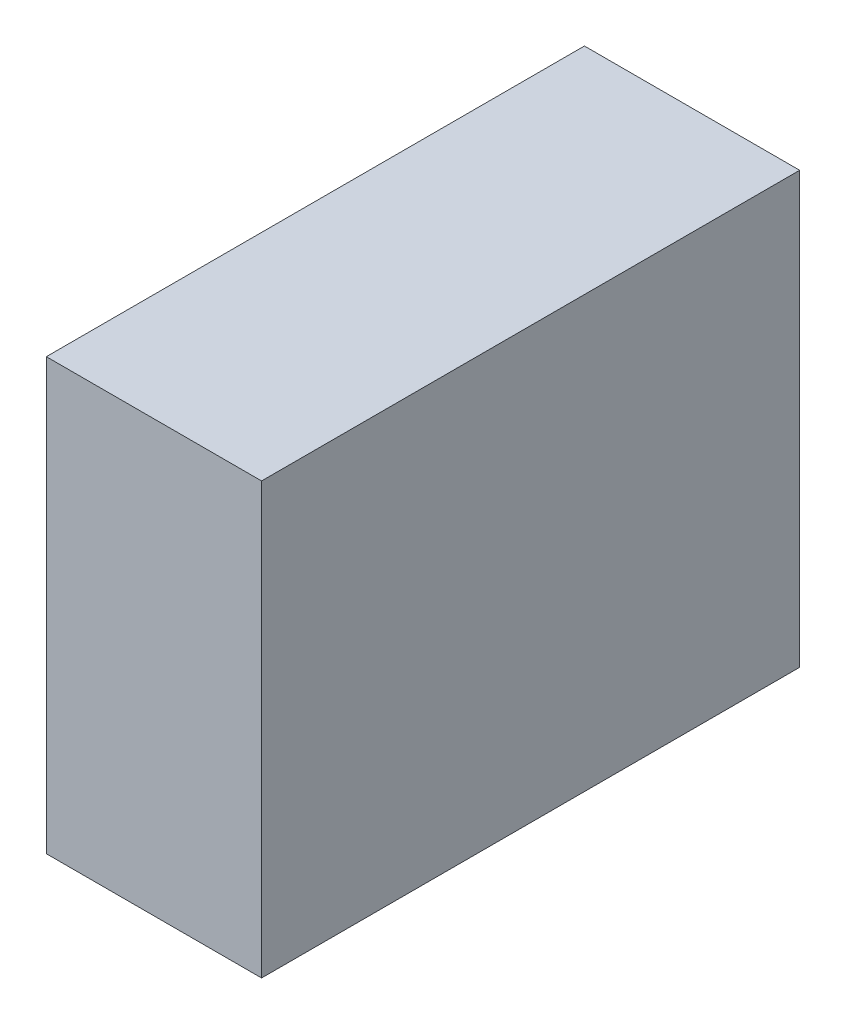
ISO-10303-21;
HEADER;
FILE_DESCRIPTION(('STEP AP214'),'2;1');
FILE_NAME('part.step','',(''),(''),'','','');
FILE_SCHEMA(('AUTOMOTIVE_DESIGN { 1 0 10303 214 1 1 1 1 }'));
ENDSEC;
DATA;
#1=APPLICATION_CONTEXT('core data for automotive mechanical design processes');
#2=APPLICATION_PROTOCOL_DEFINITION('international standard','automotive_design',2000,#1);
#3=PRODUCT_CONTEXT('',#1,'mechanical');
#4=PRODUCT('Part','Part','',(#3));
#5=PRODUCT_RELATED_PRODUCT_CATEGORY('part','',(#4));
#6=PRODUCT_DEFINITION_FORMATION('','',#4);
#7=PRODUCT_DEFINITION_CONTEXT('part definition',#1,'design');
#8=PRODUCT_DEFINITION('design','',#6,#7);
#9=PRODUCT_DEFINITION_SHAPE('','',#8);
#10=(LENGTH_UNIT() NAMED_UNIT(*) SI_UNIT(.MILLI.,.METRE.));
#11=(NAMED_UNIT(*) PLANE_ANGLE_UNIT() SI_UNIT($,.RADIAN.));
#12=(NAMED_UNIT(*) SI_UNIT($,.STERADIAN.) SOLID_ANGLE_UNIT());
#13=UNCERTAINTY_MEASURE_WITH_UNIT(LENGTH_MEASURE(1.E-05),#10,'distance_accuracy_value','');
#14=(GEOMETRIC_REPRESENTATION_CONTEXT(3) GLOBAL_UNCERTAINTY_ASSIGNED_CONTEXT((#13)) GLOBAL_UNIT_ASSIGNED_CONTEXT((#10,
#11,#12)) REPRESENTATION_CONTEXT('',''));
#15=CARTESIAN_POINT('',(0.,0.,0.));
#16=DIRECTION('',(0.,0.,1.));
#17=DIRECTION('',(1.,0.,0.));
#18=AXIS2_PLACEMENT_3D('',#15,#16,#17);
#19=CARTESIAN_POINT('',(-101.6,-203.2,254.));
#20=DIRECTION('',(1.,0.,0.));
#21=DIRECTION('',(0.,0.,-1.));
#22=AXIS2_PLACEMENT_3D('',#19,#20,#21);
#23=PLANE('',#22);
#24=DIRECTION('',(0.,-1.,0.));
#25=VECTOR('',#24,1.);
#26=CARTESIAN_POINT('',(-101.6,-203.2,-254.));
#27=LINE('',#26,#25);
#28=CARTESIAN_POINT('',(-101.6,203.2,-254.));
#29=VERTEX_POINT('',#28);
#30=CARTESIAN_POINT('',(-101.6,-203.2,-254.));
#31=VERTEX_POINT('',#30);
#32=EDGE_CURVE('E113',#29,#31,#27,.T.);
#33=ORIENTED_EDGE('',*,*,#32,.T.);
#34=DIRECTION('',(0.,0.,-1.));
#35=VECTOR('',#34,1.);
#36=CARTESIAN_POINT('',(-101.6,-203.2,254.));
#37=LINE('',#36,#35);
#38=CARTESIAN_POINT('',(-101.6,-203.2,254.));
#39=VERTEX_POINT('',#38);
#40=EDGE_CURVE('E11',#39,#31,#37,.T.);
#41=ORIENTED_EDGE('',*,*,#40,.F.);
#42=DIRECTION('',(0.,-1.,0.));
#43=VECTOR('',#42,1.);
#44=CARTESIAN_POINT('',(-101.6,-203.2,254.));
#45=LINE('',#44,#43);
#46=CARTESIAN_POINT('',(-101.6,203.2,254.));
#47=VERTEX_POINT('',#46);
#48=EDGE_CURVE('E97',#47,#39,#45,.T.);
#49=ORIENTED_EDGE('',*,*,#48,.F.);
#50=DIRECTION('',(0.,0.,-1.));
#51=VECTOR('',#50,1.);
#52=CARTESIAN_POINT('',(-101.6,203.2,254.));
#53=LINE('',#52,#51);
#54=EDGE_CURVE('E109',#47,#29,#53,.T.);
#55=ORIENTED_EDGE('',*,*,#54,.T.);
#56=EDGE_LOOP('',(#33,#41,#49,#55));
#57=FACE_BOUND('',#56,.T.);
#58=ADVANCED_FACE('F45',(#57),#23,.F.);
#59=CARTESIAN_POINT('',(101.6,-203.2,254.));
#60=DIRECTION('',(0.,1.,0.));
#61=DIRECTION('',(-1.,0.,0.));
#62=AXIS2_PLACEMENT_3D('',#59,#60,#61);
#63=PLANE('',#62);
#64=DIRECTION('',(1.,0.,0.));
#65=VECTOR('',#64,1.);
#66=CARTESIAN_POINT('',(101.6,-203.2,-254.));
#67=LINE('',#66,#65);
#68=CARTESIAN_POINT('',(101.6,-203.2,-254.));
#69=VERTEX_POINT('',#68);
#70=EDGE_CURVE('E102',#31,#69,#67,.T.);
#71=ORIENTED_EDGE('',*,*,#70,.T.);
#72=DIRECTION('',(0.,0.,-1.));
#73=VECTOR('',#72,1.);
#74=CARTESIAN_POINT('',(101.6,-203.2,254.));
#75=LINE('',#74,#73);
#76=CARTESIAN_POINT('',(101.6,-203.2,254.));
#77=VERTEX_POINT('',#76);
#78=EDGE_CURVE('E54',#77,#69,#75,.T.);
#79=ORIENTED_EDGE('',*,*,#78,.F.);
#80=DIRECTION('',(1.,0.,0.));
#81=VECTOR('',#80,1.);
#82=CARTESIAN_POINT('',(101.6,-203.2,254.));
#83=LINE('',#82,#81);
#84=EDGE_CURVE('E92',#39,#77,#83,.T.);
#85=ORIENTED_EDGE('',*,*,#84,.F.);
#86=ORIENTED_EDGE('',*,*,#40,.T.);
#87=EDGE_LOOP('',(#71,#79,#85,#86));
#88=FACE_BOUND('',#87,.T.);
#89=ADVANCED_FACE('F101',(#88),#63,.F.);
#90=CARTESIAN_POINT('',(101.6,-203.2,254.));
#91=DIRECTION('',(-1.,0.,0.));
#92=DIRECTION('',(0.,0.,1.));
#93=AXIS2_PLACEMENT_3D('',#90,#91,#92);
#94=PLANE('',#93);
#95=DIRECTION('',(0.,1.,0.));
#96=VECTOR('',#95,1.);
#97=CARTESIAN_POINT('',(101.6,-203.2,-254.));
#98=LINE('',#97,#96);
#99=CARTESIAN_POINT('',(101.6,203.2,-254.));
#100=VERTEX_POINT('',#99);
#101=EDGE_CURVE('E79',#69,#100,#98,.T.);
#102=ORIENTED_EDGE('',*,*,#101,.T.);
#103=DIRECTION('',(0.,0.,-1.));
#104=VECTOR('',#103,1.);
#105=CARTESIAN_POINT('',(101.6,203.2,254.));
#106=LINE('',#105,#104);
#107=CARTESIAN_POINT('',(101.6,203.2,254.));
#108=VERTEX_POINT('',#107);
#109=EDGE_CURVE('E104',#108,#100,#106,.T.);
#110=ORIENTED_EDGE('',*,*,#109,.F.);
#111=DIRECTION('',(0.,1.,0.));
#112=VECTOR('',#111,1.);
#113=CARTESIAN_POINT('',(101.6,-203.2,254.));
#114=LINE('',#113,#112);
#115=EDGE_CURVE('E95',#77,#108,#114,.T.);
#116=ORIENTED_EDGE('',*,*,#115,.F.);
#117=ORIENTED_EDGE('',*,*,#78,.T.);
#118=EDGE_LOOP('',(#102,#110,#116,#117));
#119=FACE_BOUND('',#118,.T.);
#120=ADVANCED_FACE('F105',(#119),#94,.F.);
#121=CARTESIAN_POINT('',(101.6,203.2,254.));
#122=DIRECTION('',(0.,-1.,0.));
#123=DIRECTION('',(1.,0.,0.));
#124=AXIS2_PLACEMENT_3D('',#121,#122,#123);
#125=PLANE('',#124);
#126=DIRECTION('',(-1.,0.,0.));
#127=VECTOR('',#126,1.);
#128=CARTESIAN_POINT('',(101.6,203.2,-254.));
#129=LINE('',#128,#127);
#130=EDGE_CURVE('E85',#100,#29,#129,.T.);
#131=ORIENTED_EDGE('',*,*,#130,.T.);
#132=ORIENTED_EDGE('',*,*,#54,.F.);
#133=DIRECTION('',(-1.,0.,0.));
#134=VECTOR('',#133,1.);
#135=CARTESIAN_POINT('',(101.6,203.2,254.));
#136=LINE('',#135,#134);
#137=EDGE_CURVE('E62',#108,#47,#136,.T.);
#138=ORIENTED_EDGE('',*,*,#137,.F.);
#139=ORIENTED_EDGE('',*,*,#109,.T.);
#140=EDGE_LOOP('',(#131,#132,#138,#139));
#141=FACE_BOUND('',#140,.T.);
#142=ADVANCED_FACE('F126',(#141),#125,.F.);
#143=CARTESIAN_POINT('',(0.,0.,254.));
#144=DIRECTION('',(0.,0.,1.));
#145=DIRECTION('',(1.,0.,0.));
#146=AXIS2_PLACEMENT_3D('',#143,#144,#145);
#147=PLANE('',#146);
#148=ORIENTED_EDGE('',*,*,#48,.T.);
#149=ORIENTED_EDGE('',*,*,#84,.T.);
#150=ORIENTED_EDGE('',*,*,#115,.T.);
#151=ORIENTED_EDGE('',*,*,#137,.T.);
#152=EDGE_LOOP('',(#148,#149,#150,#151));
#153=FACE_BOUND('',#152,.T.);
#154=ADVANCED_FACE('F93',(#153),#147,.T.);
#155=CARTESIAN_POINT('',(0.,0.,-254.));
#156=DIRECTION('',(0.,0.,1.));
#157=DIRECTION('',(1.,0.,0.));
#158=AXIS2_PLACEMENT_3D('',#155,#156,#157);
#159=PLANE('',#158);
#160=ORIENTED_EDGE('',*,*,#32,.F.);
#161=ORIENTED_EDGE('',*,*,#130,.F.);
#162=ORIENTED_EDGE('',*,*,#101,.F.);
#163=ORIENTED_EDGE('',*,*,#70,.F.);
#164=EDGE_LOOP('',(#160,#161,#162,#163));
#165=FACE_BOUND('',#164,.T.);
#166=ADVANCED_FACE('F129',(#165),#159,.F.);
#167=CLOSED_SHELL('',(#58,#89,#120,#142,#154,#166));
#168=MANIFOLD_SOLID_BREP('B2',#167);
#169=ADVANCED_BREP_SHAPE_REPRESENTATION('',(#18,#168),#14);
#170=SHAPE_DEFINITION_REPRESENTATION(#9,#169);
ENDSEC;
END-ISO-10303-21;
